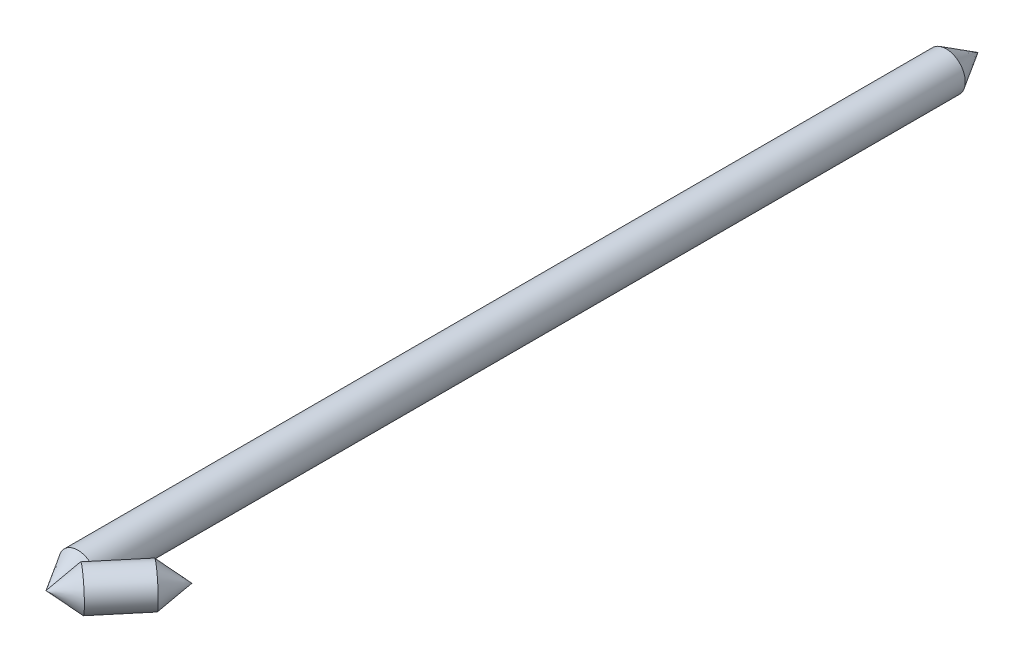
ISO-10303-21;
HEADER;
FILE_DESCRIPTION(('STEP AP214'),'2;1');
FILE_NAME('part.step','',(''),(''),'','','');
FILE_SCHEMA(('AUTOMOTIVE_DESIGN { 1 0 10303 214 1 1 1 1 }'));
ENDSEC;
DATA;
#1=APPLICATION_CONTEXT('core data for automotive mechanical design processes');
#2=APPLICATION_PROTOCOL_DEFINITION('international standard','automotive_design',2000,#1);
#3=PRODUCT_CONTEXT('',#1,'mechanical');
#4=PRODUCT('Part','Part','',(#3));
#5=PRODUCT_RELATED_PRODUCT_CATEGORY('part','',(#4));
#6=PRODUCT_DEFINITION_FORMATION('','',#4);
#7=PRODUCT_DEFINITION_CONTEXT('part definition',#1,'design');
#8=PRODUCT_DEFINITION('design','',#6,#7);
#9=PRODUCT_DEFINITION_SHAPE('','',#8);
#10=(LENGTH_UNIT() NAMED_UNIT(*) SI_UNIT(.MILLI.,.METRE.));
#11=(NAMED_UNIT(*) PLANE_ANGLE_UNIT() SI_UNIT($,.RADIAN.));
#12=(NAMED_UNIT(*) SI_UNIT($,.STERADIAN.) SOLID_ANGLE_UNIT());
#13=UNCERTAINTY_MEASURE_WITH_UNIT(LENGTH_MEASURE(1.E-05),#10,'distance_accuracy_value','');
#14=(GEOMETRIC_REPRESENTATION_CONTEXT(3) GLOBAL_UNCERTAINTY_ASSIGNED_CONTEXT((#13)) GLOBAL_UNIT_ASSIGNED_CONTEXT((#10,
#11,#12)) REPRESENTATION_CONTEXT('',''));
#15=CARTESIAN_POINT('',(0.,0.,0.));
#16=DIRECTION('',(0.,0.,1.));
#17=DIRECTION('',(1.,0.,0.));
#18=AXIS2_PLACEMENT_3D('',#15,#16,#17);
#19=CARTESIAN_POINT('',(0.,0.,-185.7375));
#20=DIRECTION('',(0.,0.,-1.));
#21=DIRECTION('',(-1.,0.,0.));
#22=AXIS2_PLACEMENT_3D('',#19,#20,#21);
#23=CYLINDRICAL_SURFACE('',#22,7.62000000000006);
#24=CARTESIAN_POINT('',(0.,0.,-173.0375));
#25=DIRECTION('',(0.,0.,-1.));
#26=DIRECTION('',(-1.,0.,0.));
#27=AXIS2_PLACEMENT_3D('',#24,#25,#26);
#28=CIRCLE('',#27,7.62000000000012);
#29=CARTESIAN_POINT('',(-7.6200000000002,0.,-173.0375));
#30=VERTEX_POINT('',#29);
#31=EDGE_CURVE('E98',#30,#30,#28,.T.);
#32=ORIENTED_EDGE('',*,*,#31,.F.);
#33=EDGE_LOOP('',(#32));
#34=FACE_BOUND('',#33,.T.);
#35=CARTESIAN_POINT('',(0.,0.,173.0375));
#36=DIRECTION('',(0.,0.,-1.));
#37=DIRECTION('',(-1.,0.,0.));
#38=AXIS2_PLACEMENT_3D('',#35,#36,#37);
#39=CIRCLE('',#38,7.62);
#40=CARTESIAN_POINT('',(4.62242197518076,-6.05785565058846,173.0375));
#41=VERTEX_POINT('',#40);
#42=CARTESIAN_POINT('',(4.62242197518076,6.05785565058844,173.0375));
#43=VERTEX_POINT('',#42);
#44=EDGE_CURVE('E92',#41,#43,#39,.T.);
#45=ORIENTED_EDGE('',*,*,#44,.T.);
#46=CARTESIAN_POINT('',(0.,0.,185.7375));
#47=DIRECTION('',(-0.939692620785909,0.,-0.342020143325666));
#48=DIRECTION('',(0.342020143325666,0.,-0.939692620785909));
#49=AXIS2_PLACEMENT_3D('',#46,#47,#48);
#50=ELLIPSE('',#49,22.279389529243,7.62000000000003);
#51=EDGE_CURVE('E89',#43,#41,#50,.T.);
#52=ORIENTED_EDGE('',*,*,#51,.T.);
#53=EDGE_LOOP('',(#45,#52));
#54=FACE_BOUND('',#53,.T.);
#55=ADVANCED_FACE('F42',(#34,#54),#23,.T.);
#56=CARTESIAN_POINT('',(0.,0.,-173.0375));
#57=DIRECTION('',(0.,0.,1.));
#58=DIRECTION('',(1.,0.,0.));
#59=AXIS2_PLACEMENT_3D('',#56,#57,#58);
#60=CONICAL_SURFACE('',#59,7.62000000000012,0.540419500270592);
#61=CARTESIAN_POINT('',(0.,0.,-185.7375));
#62=VERTEX_POINT('',#61);
#63=VERTEX_LOOP('',#62);
#64=FACE_BOUND('',#63,.T.);
#65=ORIENTED_EDGE('',*,*,#31,.T.);
#66=EDGE_LOOP('',(#65));
#67=FACE_BOUND('',#66,.T.);
#68=ADVANCED_FACE('F122',(#64,#67),#60,.T.);
#69=CARTESIAN_POINT('',(0.,0.,185.7375));
#70=DIRECTION('',(0.,0.,-1.));
#71=DIRECTION('',(-1.,0.,0.));
#72=AXIS2_PLACEMENT_3D('',#69,#70,#71);
#73=CONICAL_SURFACE('',#72,0.,0.540419500270585);
#74=ORIENTED_EDGE('',*,*,#44,.F.);
#75=CARTESIAN_POINT('',(4.62260678014365,-6.0578655787802,173.0373));
#76=CARTESIAN_POINT('',(4.47151342811458,-6.04973164027021,173.200804757249));
#77=CARTESIAN_POINT('',(4.31915755702627,-6.04024230801808,173.363097996914));
#78=CARTESIAN_POINT('',(4.01166814954536,-6.01804583531763,173.684858140584));
#79=CARTESIAN_POINT('',(3.85653413422289,-6.00533813498799,173.844324547652));
#80=CARTESIAN_POINT('',(3.54406677439586,-5.9762728020425,174.15918601829));
#81=CARTESIAN_POINT('',(3.38674819486788,-5.95993362586443,174.314597379042));
#82=CARTESIAN_POINT('',(3.06894897014332,-5.92292852376086,174.621643489123));
#83=CARTESIAN_POINT('',(2.90846826428544,-5.90226251475733,174.773278165874));
#84=CARTESIAN_POINT('',(2.58376617144155,-5.8557697336365,175.072525944585));
#85=CARTESIAN_POINT('',(2.41953645815597,-5.82993022731256,175.220128081304));
#86=CARTESIAN_POINT('',(2.08765304728688,-5.77217405480186,175.510154987696));
#87=CARTESIAN_POINT('',(1.92000003855944,-5.74025860070202,175.652580783257));
#88=CARTESIAN_POINT('',(1.58041316599877,-5.66901951795191,175.932128504829));
#89=CARTESIAN_POINT('',(1.40846240020399,-5.62966048687132,176.069221146185));
#90=CARTESIAN_POINT('',(1.14805352958127,-5.56408696621293,176.269618170354));
#91=CARTESIAN_POINT('',(1.06080196064058,-5.54112964146907,176.335568442228));
#92=CARTESIAN_POINT('',(0.885536818383031,-5.49283361411674,176.465580279053));
#93=CARTESIAN_POINT('',(0.797523147741123,-5.46749460315562,176.529641598031));
#94=CARTESIAN_POINT('',(0.709161771239444,-5.44086500228386,176.592689329634));
#95=B_SPLINE_CURVE_WITH_KNOTS('',3,(#75,#76,#77,#78,#79,#80,#81,#82,#83,#84,#85,#86,#87,#88,#89,
#90,#91,#92,#93,#94),.UNSPECIFIED.,.F.,.F.,(4,2,2,2,2,2,2,2,2,4),(0.,0.66834185465694,
1.33680005693112,2.00193560016473,2.66708391560885,3.33389003344481,4.00056326968048,
4.67049086577145,5.00571860981093,5.34098981512737),.UNSPECIFIED.);
#96=CARTESIAN_POINT('',(2.84601562205061,-5.89303022968151,174.830365458169));
#97=VERTEX_POINT('',#96);
#98=EDGE_CURVE('E11',#41,#97,#95,.T.);
#99=ORIENTED_EDGE('',*,*,#98,.T.);
#100=DIRECTION('',(0.223746966081351,-0.46329599342357,-0.857492925712544));
#101=VECTOR('',#100,1.);
#102=CARTESIAN_POINT('',(0.,0.,185.7375));
#103=LINE('',#102,#101);
#104=CARTESIAN_POINT('',(0.,0.,185.7375));
#105=VERTEX_POINT('',#104);
#106=EDGE_CURVE('E104',#97,#105,#103,.F.);
#107=ORIENTED_EDGE('',*,*,#106,.T.);
#108=DIRECTION('',(0.223746966081351,0.46329599342357,-0.857492925712544));
#109=VECTOR('',#108,1.);
#110=CARTESIAN_POINT('',(0.,0.,185.7375));
#111=LINE('',#110,#109);
#112=CARTESIAN_POINT('',(2.84601562205061,5.89303022968151,174.830365458169));
#113=VERTEX_POINT('',#112);
#114=EDGE_CURVE('E101',#105,#113,#111,.T.);
#115=ORIENTED_EDGE('',*,*,#114,.T.);
#116=CARTESIAN_POINT('',(0.709161771239444,5.44086500228386,176.592689329634));
#117=CARTESIAN_POINT('',(0.797523147741122,5.46749460315562,176.529641598031));
#118=CARTESIAN_POINT('',(0.885536818383028,5.49283361411674,176.465580279053));
#119=CARTESIAN_POINT('',(1.06080196064058,5.54112964146907,176.335568442228));
#120=CARTESIAN_POINT('',(1.14805352958127,5.56408696621293,176.269618170354));
#121=CARTESIAN_POINT('',(1.40846240020397,5.62966048687131,176.069221146185));
#122=CARTESIAN_POINT('',(1.58041316599875,5.6690195179519,175.932128504829));
#123=CARTESIAN_POINT('',(1.92000003855941,5.74025860070202,175.652580783258));
#124=CARTESIAN_POINT('',(2.08765304728685,5.77217405480185,175.510154987696));
#125=CARTESIAN_POINT('',(2.41953645815595,5.82993022731256,175.220128081304));
#126=CARTESIAN_POINT('',(2.58376617144153,5.8557697336365,175.072525944585));
#127=CARTESIAN_POINT('',(2.90846826428544,5.90226251475733,174.773278165874));
#128=CARTESIAN_POINT('',(3.06894897014332,5.92292852376086,174.621643489123));
#129=CARTESIAN_POINT('',(3.38674819486788,5.95993362586443,174.314597379042));
#130=CARTESIAN_POINT('',(3.54406677439586,5.9762728020425,174.15918601829));
#131=CARTESIAN_POINT('',(3.85653413422289,6.00533813498799,173.844324547652));
#132=CARTESIAN_POINT('',(4.01166814954536,6.01804583531763,173.684858140584));
#133=CARTESIAN_POINT('',(4.31915755702627,6.04024230801808,173.363097996914));
#134=CARTESIAN_POINT('',(4.47151342811458,6.04973164027021,173.200804757249));
#135=CARTESIAN_POINT('',(4.62260678014364,6.0578655787802,173.0373));
#136=B_SPLINE_CURVE_WITH_KNOTS('',3,(#116,#117,#118,#119,#120,#121,#122,#123,#124,#125,#126,
#127,#128,#129,#130,#131,#132,#133,#134,#135),.UNSPECIFIED.,.F.,.F.,(4,2,2,2,2,2,2,2,2,4),(0.,
0.335271205316433,0.670498949355912,1.34042654544685,2.00709978168252,2.67390589951852,
3.33905421496264,4.00418975819625,4.67264796047043,5.34098981512737),.UNSPECIFIED.);
#137=EDGE_CURVE('E55',#113,#43,#136,.T.);
#138=ORIENTED_EDGE('',*,*,#137,.T.);
#139=EDGE_LOOP('',(#74,#99,#107,#115,#138));
#140=FACE_BOUND('',#139,.T.);
#141=ADVANCED_FACE('F111',(#140),#73,.T.);
#142=CARTESIAN_POINT('',(0.,0.,185.7375));
#143=DIRECTION('',(-0.642787609686535,0.,0.766044443118982));
#144=DIRECTION('',(0.766044443118982,0.,0.642787609686535));
#145=AXIS2_PLACEMENT_3D('',#142,#143,#144);
#146=CYLINDRICAL_SURFACE('',#145,7.61999999999999);
#147=CARTESIAN_POINT('',(19.9844381620057,0.,161.920974024453));
#148=DIRECTION('',(-0.642787609686535,0.,0.766044443118982));
#149=DIRECTION('',(0.766044443118982,0.,0.642787609686535));
#150=AXIS2_PLACEMENT_3D('',#147,#148,#149);
#151=CIRCLE('',#150,7.61999999999998);
#152=CARTESIAN_POINT('',(25.8216968185723,0.,166.819015610264));
#153=VERTEX_POINT('',#152);
#154=EDGE_CURVE('E87',#153,#153,#151,.T.);
#155=ORIENTED_EDGE('',*,*,#154,.T.);
#156=EDGE_LOOP('',(#155));
#157=FACE_BOUND('',#156,.T.);
#158=ORIENTED_EDGE('',*,*,#98,.F.);
#159=ORIENTED_EDGE('',*,*,#51,.F.);
#160=ORIENTED_EDGE('',*,*,#137,.F.);
#161=CARTESIAN_POINT('',(6.54662042780609,0.,177.935541585811));
#162=DIRECTION('',(-0.642787609686535,0.,0.766044443118982));
#163=DIRECTION('',(0.766044443118982,0.,0.642787609686535));
#164=AXIS2_PLACEMENT_3D('',#161,#162,#163);
#165=CIRCLE('',#164,7.62);
#166=EDGE_CURVE('E62',#97,#113,#165,.T.);
#167=ORIENTED_EDGE('',*,*,#166,.F.);
#168=EDGE_LOOP('',(#158,#159,#160,#167));
#169=FACE_BOUND('',#168,.T.);
#170=ADVANCED_FACE('F113',(#157,#169),#146,.T.);
#171=CARTESIAN_POINT('',(0.,0.,185.7375));
#172=DIRECTION('',(0.642787609686535,0.,-0.766044443118982));
#173=DIRECTION('',(-0.766044443118982,0.,-0.642787609686535));
#174=AXIS2_PLACEMENT_3D('',#171,#172,#173);
#175=CONICAL_SURFACE('',#174,0.,0.642334420657946);
#176=ORIENTED_EDGE('',*,*,#106,.F.);
#177=ORIENTED_EDGE('',*,*,#166,.T.);
#178=ORIENTED_EDGE('',*,*,#114,.F.);
#179=EDGE_LOOP('',(#176,#177,#178));
#180=FACE_BOUND('',#179,.T.);
#181=ADVANCED_FACE('F83',(#180),#175,.T.);
#182=CARTESIAN_POINT('',(19.9844381620057,0.,161.920974024453));
#183=DIRECTION('',(-0.642787609686535,0.,0.766044443118982));
#184=DIRECTION('',(0.766044443118982,0.,0.642787609686535));
#185=AXIS2_PLACEMENT_3D('',#182,#183,#184);
#186=CONICAL_SURFACE('',#185,7.61999999999999,0.642334420657944);
#187=CARTESIAN_POINT('',(26.5310585898118,0.,154.119015610264));
#188=VERTEX_POINT('',#187);
#189=VERTEX_LOOP('',#188);
#190=FACE_BOUND('',#189,.T.);
#191=ORIENTED_EDGE('',*,*,#154,.F.);
#192=EDGE_LOOP('',(#191));
#193=FACE_BOUND('',#192,.T.);
#194=ADVANCED_FACE('F80',(#190,#193),#186,.T.);
#195=CLOSED_SHELL('',(#55,#68,#141,#170,#181,#194));
#196=MANIFOLD_SOLID_BREP('B2',#195);
#197=ADVANCED_BREP_SHAPE_REPRESENTATION('',(#18,#196),#14);
#198=SHAPE_DEFINITION_REPRESENTATION(#9,#197);
ENDSEC;
END-ISO-10303-21;
